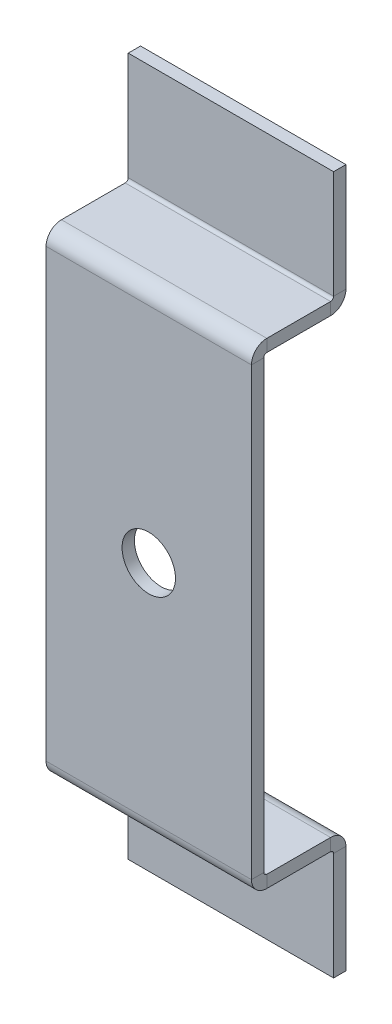
ISO-10303-21;
HEADER;
FILE_DESCRIPTION(('STEP AP214'),'2;1');
FILE_NAME('part.step','',(''),(''),'','','');
FILE_SCHEMA(('AUTOMOTIVE_DESIGN { 1 0 10303 214 1 1 1 1 }'));
ENDSEC;
DATA;
#1=APPLICATION_CONTEXT('core data for automotive mechanical design processes');
#2=APPLICATION_PROTOCOL_DEFINITION('international standard','automotive_design',2000,#1);
#3=PRODUCT_CONTEXT('',#1,'mechanical');
#4=PRODUCT('Part','Part','',(#3));
#5=PRODUCT_RELATED_PRODUCT_CATEGORY('part','',(#4));
#6=PRODUCT_DEFINITION_FORMATION('','',#4);
#7=PRODUCT_DEFINITION_CONTEXT('part definition',#1,'design');
#8=PRODUCT_DEFINITION('design','',#6,#7);
#9=PRODUCT_DEFINITION_SHAPE('','',#8);
#10=(LENGTH_UNIT() NAMED_UNIT(*) SI_UNIT(.MILLI.,.METRE.));
#11=(NAMED_UNIT(*) PLANE_ANGLE_UNIT() SI_UNIT($,.RADIAN.));
#12=(NAMED_UNIT(*) SI_UNIT($,.STERADIAN.) SOLID_ANGLE_UNIT());
#13=UNCERTAINTY_MEASURE_WITH_UNIT(LENGTH_MEASURE(1.E-05),#10,'distance_accuracy_value','');
#14=(GEOMETRIC_REPRESENTATION_CONTEXT(3) GLOBAL_UNCERTAINTY_ASSIGNED_CONTEXT((#13)) GLOBAL_UNIT_ASSIGNED_CONTEXT((#10,
#11,#12)) REPRESENTATION_CONTEXT('',''));
#15=CARTESIAN_POINT('',(0.,0.,0.));
#16=DIRECTION('',(0.,0.,1.));
#17=DIRECTION('',(1.,0.,0.));
#18=AXIS2_PLACEMENT_3D('',#15,#16,#17);
#19=CARTESIAN_POINT('',(0.,113.,-20.));
#20=DIRECTION('',(-1.,0.,0.));
#21=DIRECTION('',(0.,0.,1.));
#22=AXIS2_PLACEMENT_3D('',#19,#20,#21);
#23=PLANE('',#22);
#24=DIRECTION('',(0.,0.,-1.));
#25=VECTOR('',#24,1.);
#26=CARTESIAN_POINT('',(0.,113.,-20.));
#27=LINE('',#26,#25);
#28=CARTESIAN_POINT('',(0.,113.,-3.7366));
#29=VERTEX_POINT('',#28);
#30=CARTESIAN_POINT('',(0.,113.,-19.2634));
#31=VERTEX_POINT('',#30);
#32=EDGE_CURVE('E351',#29,#31,#27,.T.);
#33=ORIENTED_EDGE('',*,*,#32,.T.);
#34=DIRECTION('',(0.,-1.,0.));
#35=VECTOR('',#34,1.);
#36=CARTESIAN_POINT('',(0.,113.,-19.2634));
#37=LINE('',#36,#35);
#38=CARTESIAN_POINT('',(0.,110.,-19.2634));
#39=VERTEX_POINT('',#38);
#40=EDGE_CURVE('E233',#31,#39,#37,.T.);
#41=ORIENTED_EDGE('',*,*,#40,.T.);
#42=DIRECTION('',(0.,0.,-1.));
#43=VECTOR('',#42,1.);
#44=CARTESIAN_POINT('',(0.,110.,-20.));
#45=LINE('',#44,#43);
#46=CARTESIAN_POINT('',(0.,110.,-3.73660000000001));
#47=VERTEX_POINT('',#46);
#48=EDGE_CURVE('E350',#47,#39,#45,.T.);
#49=ORIENTED_EDGE('',*,*,#48,.F.);
#50=DIRECTION('',(0.,1.,0.));
#51=VECTOR('',#50,1.);
#52=CARTESIAN_POINT('',(0.,110.,-3.73660000000001));
#53=LINE('',#52,#51);
#54=EDGE_CURVE('E336',#47,#29,#53,.T.);
#55=ORIENTED_EDGE('',*,*,#54,.T.);
#56=EDGE_LOOP('',(#33,#41,#49,#55));
#57=FACE_BOUND('',#56,.T.);
#58=ADVANCED_FACE('F39',(#57),#23,.T.);
#59=CARTESIAN_POINT('',(0.,113.,3.69664246101139E-13));
#60=DIRECTION('',(0.,1.,0.));
#61=DIRECTION('',(0.,0.,1.));
#62=AXIS2_PLACEMENT_3D('',#59,#60,#61);
#63=PLANE('',#62);
#64=DIRECTION('',(0.,0.,1.));
#65=VECTOR('',#64,1.);
#66=CARTESIAN_POINT('',(50.,113.,-2.99999999999999));
#67=LINE('',#66,#65);
#68=CARTESIAN_POINT('',(50.,113.,-19.2634));
#69=VERTEX_POINT('',#68);
#70=CARTESIAN_POINT('',(50.,113.,-3.7366));
#71=VERTEX_POINT('',#70);
#72=EDGE_CURVE('E353',#69,#71,#67,.T.);
#73=ORIENTED_EDGE('',*,*,#72,.F.);
#74=DIRECTION('',(-1.,0.,0.));
#75=VECTOR('',#74,1.);
#76=CARTESIAN_POINT('',(0.,113.,-19.2634));
#77=LINE('',#76,#75);
#78=EDGE_CURVE('E63',#31,#69,#77,.F.);
#79=ORIENTED_EDGE('',*,*,#78,.F.);
#80=ORIENTED_EDGE('',*,*,#32,.F.);
#81=DIRECTION('',(1.,0.,0.));
#82=VECTOR('',#81,1.);
#83=CARTESIAN_POINT('',(0.,113.,-3.7366));
#84=LINE('',#83,#82);
#85=EDGE_CURVE('E345',#29,#71,#84,.T.);
#86=ORIENTED_EDGE('',*,*,#85,.T.);
#87=EDGE_LOOP('',(#73,#79,#80,#86));
#88=FACE_BOUND('',#87,.T.);
#89=ADVANCED_FACE('F400',(#88),#63,.T.);
#90=CARTESIAN_POINT('',(0.,110.,3.59189802084609E-13));
#91=DIRECTION('',(0.,1.,0.));
#92=DIRECTION('',(0.,0.,1.));
#93=AXIS2_PLACEMENT_3D('',#90,#91,#92);
#94=PLANE('',#93);
#95=DIRECTION('',(-1.,0.,0.));
#96=VECTOR('',#95,1.);
#97=CARTESIAN_POINT('',(0.,110.,-19.2634));
#98=LINE('',#97,#96);
#99=CARTESIAN_POINT('',(50.,110.,-19.2634));
#100=VERTEX_POINT('',#99);
#101=EDGE_CURVE('E186',#39,#100,#98,.F.);
#102=ORIENTED_EDGE('',*,*,#101,.T.);
#103=DIRECTION('',(0.,0.,1.));
#104=VECTOR('',#103,1.);
#105=CARTESIAN_POINT('',(50.,110.,-3.));
#106=LINE('',#105,#104);
#107=CARTESIAN_POINT('',(50.,110.,-3.73660000000001));
#108=VERTEX_POINT('',#107);
#109=EDGE_CURVE('E354',#100,#108,#106,.T.);
#110=ORIENTED_EDGE('',*,*,#109,.T.);
#111=DIRECTION('',(1.,0.,0.));
#112=VECTOR('',#111,1.);
#113=CARTESIAN_POINT('',(0.,110.,-3.73660000000001));
#114=LINE('',#113,#112);
#115=EDGE_CURVE('E339',#47,#108,#114,.T.);
#116=ORIENTED_EDGE('',*,*,#115,.F.);
#117=ORIENTED_EDGE('',*,*,#48,.T.);
#118=EDGE_LOOP('',(#102,#110,#116,#117));
#119=FACE_BOUND('',#118,.T.);
#120=ADVANCED_FACE('F408',(#119),#94,.F.);
#121=CARTESIAN_POINT('',(50.,-3.,-2.99999999999999));
#122=DIRECTION('',(1.,0.,0.));
#123=DIRECTION('',(0.,0.,-1.));
#124=AXIS2_PLACEMENT_3D('',#121,#122,#123);
#125=PLANE('',#124);
#126=DIRECTION('',(0.,0.,-1.));
#127=VECTOR('',#126,1.);
#128=CARTESIAN_POINT('',(50.,-3.,-2.99999999999999));
#129=LINE('',#128,#127);
#130=CARTESIAN_POINT('',(50.,-3.,-3.73659999999999));
#131=VERTEX_POINT('',#130);
#132=CARTESIAN_POINT('',(50.,-3.00000000000006,-19.2634));
#133=VERTEX_POINT('',#132);
#134=EDGE_CURVE('E306',#131,#133,#129,.T.);
#135=ORIENTED_EDGE('',*,*,#134,.T.);
#136=DIRECTION('',(0.,1.,0.));
#137=VECTOR('',#136,1.);
#138=CARTESIAN_POINT('',(50.,-3.00000000000006,-19.2634));
#139=LINE('',#138,#137);
#140=CARTESIAN_POINT('',(50.,0.,-19.2634));
#141=VERTEX_POINT('',#140);
#142=EDGE_CURVE('E279',#133,#141,#139,.T.);
#143=ORIENTED_EDGE('',*,*,#142,.T.);
#144=DIRECTION('',(0.,0.,-1.));
#145=VECTOR('',#144,1.);
#146=CARTESIAN_POINT('',(50.,0.,-3.));
#147=LINE('',#146,#145);
#148=CARTESIAN_POINT('',(50.,0.,-3.7366));
#149=VERTEX_POINT('',#148);
#150=EDGE_CURVE('E305',#149,#141,#147,.T.);
#151=ORIENTED_EDGE('',*,*,#150,.F.);
#152=DIRECTION('',(0.,-1.,0.));
#153=VECTOR('',#152,1.);
#154=CARTESIAN_POINT('',(50.,0.,-3.7366));
#155=LINE('',#154,#153);
#156=EDGE_CURVE('E292',#149,#131,#155,.T.);
#157=ORIENTED_EDGE('',*,*,#156,.T.);
#158=EDGE_LOOP('',(#135,#143,#151,#157));
#159=FACE_BOUND('',#158,.T.);
#160=ADVANCED_FACE('F432',(#159),#125,.T.);
#161=CARTESIAN_POINT('',(0.,-2.99999999999999,0.));
#162=DIRECTION('',(0.,1.,0.));
#163=DIRECTION('',(0.,0.,1.));
#164=AXIS2_PLACEMENT_3D('',#161,#162,#163);
#165=PLANE('',#164);
#166=DIRECTION('',(1.,0.,0.));
#167=VECTOR('',#166,1.);
#168=CARTESIAN_POINT('',(50.,-3.00000000000006,-19.2634));
#169=LINE('',#168,#167);
#170=CARTESIAN_POINT('',(0.,-3.00000000000006,-19.2634));
#171=VERTEX_POINT('',#170);
#172=EDGE_CURVE('E285',#133,#171,#169,.F.);
#173=ORIENTED_EDGE('',*,*,#172,.F.);
#174=ORIENTED_EDGE('',*,*,#134,.F.);
#175=DIRECTION('',(1.,0.,0.));
#176=VECTOR('',#175,1.);
#177=CARTESIAN_POINT('',(0.,-3.,-3.73659999999999));
#178=LINE('',#177,#176);
#179=CARTESIAN_POINT('',(0.,-3.,-3.73659999999999));
#180=VERTEX_POINT('',#179);
#181=EDGE_CURVE('E301',#180,#131,#178,.T.);
#182=ORIENTED_EDGE('',*,*,#181,.F.);
#183=DIRECTION('',(0.,0.,1.));
#184=VECTOR('',#183,1.);
#185=CARTESIAN_POINT('',(0.,-3.00000000000006,-20.));
#186=LINE('',#185,#184);
#187=EDGE_CURVE('E309',#171,#180,#186,.T.);
#188=ORIENTED_EDGE('',*,*,#187,.F.);
#189=EDGE_LOOP('',(#173,#174,#182,#188));
#190=FACE_BOUND('',#189,.T.);
#191=ADVANCED_FACE('F445',(#190),#165,.F.);
#192=CARTESIAN_POINT('',(0.,0.,0.));
#193=DIRECTION('',(0.,1.,0.));
#194=DIRECTION('',(0.,0.,1.));
#195=AXIS2_PLACEMENT_3D('',#192,#193,#194);
#196=PLANE('',#195);
#197=ORIENTED_EDGE('',*,*,#150,.T.);
#198=DIRECTION('',(1.,0.,0.));
#199=VECTOR('',#198,1.);
#200=CARTESIAN_POINT('',(50.,0.,-19.2634));
#201=LINE('',#200,#199);
#202=CARTESIAN_POINT('',(0.,0.,-19.2634));
#203=VERTEX_POINT('',#202);
#204=EDGE_CURVE('E272',#141,#203,#201,.F.);
#205=ORIENTED_EDGE('',*,*,#204,.T.);
#206=DIRECTION('',(0.,0.,1.));
#207=VECTOR('',#206,1.);
#208=CARTESIAN_POINT('',(0.,0.,-20.));
#209=LINE('',#208,#207);
#210=CARTESIAN_POINT('',(0.,0.,-3.7366));
#211=VERTEX_POINT('',#210);
#212=EDGE_CURVE('E310',#203,#211,#209,.T.);
#213=ORIENTED_EDGE('',*,*,#212,.T.);
#214=DIRECTION('',(-1.,0.,0.));
#215=VECTOR('',#214,1.);
#216=CARTESIAN_POINT('',(50.,0.,-3.7366));
#217=LINE('',#216,#215);
#218=EDGE_CURVE('E295',#149,#211,#217,.T.);
#219=ORIENTED_EDGE('',*,*,#218,.F.);
#220=EDGE_LOOP('',(#197,#205,#213,#219));
#221=FACE_BOUND('',#220,.T.);
#222=ADVANCED_FACE('F429',(#221),#196,.T.);
#223=CARTESIAN_POINT('',(0.,0.,-3.));
#224=DIRECTION('',(0.,0.,-1.));
#225=DIRECTION('',(-1.,0.,0.));
#226=AXIS2_PLACEMENT_3D('',#223,#224,#225);
#227=PLANE('',#226);
#228=CARTESIAN_POINT('',(25.,54.9999999999999,-3.));
#229=DIRECTION('',(0.,0.,-1.));
#230=DIRECTION('',(-1.,0.,0.));
#231=AXIS2_PLACEMENT_3D('',#228,#229,#230);
#232=CIRCLE('',#231,6.5);
#233=CARTESIAN_POINT('',(18.5,54.9999999999999,-3.));
#234=VERTEX_POINT('',#233);
#235=EDGE_CURVE('E489',#234,#234,#232,.T.);
#236=ORIENTED_EDGE('',*,*,#235,.F.);
#237=EDGE_LOOP('',(#236));
#238=FACE_BOUND('',#237,.T.);
#239=DIRECTION('',(0.,1.,0.));
#240=VECTOR('',#239,1.);
#241=CARTESIAN_POINT('',(50.,0.,-3.));
#242=LINE('',#241,#240);
#243=CARTESIAN_POINT('',(50.,0.736600000000001,-3.));
#244=VERTEX_POINT('',#243);
#245=CARTESIAN_POINT('',(50.,109.2634,-3.));
#246=VERTEX_POINT('',#245);
#247=EDGE_CURVE('E11',#244,#246,#242,.T.);
#248=ORIENTED_EDGE('',*,*,#247,.F.);
#249=DIRECTION('',(-1.,0.,0.));
#250=VECTOR('',#249,1.);
#251=CARTESIAN_POINT('',(0.,0.736599999999997,-3.));
#252=LINE('',#251,#250);
#253=CARTESIAN_POINT('',(0.,0.736599999999997,-3.));
#254=VERTEX_POINT('',#253);
#255=EDGE_CURVE('E328',#254,#244,#252,.F.);
#256=ORIENTED_EDGE('',*,*,#255,.F.);
#257=DIRECTION('',(0.,-1.,0.));
#258=VECTOR('',#257,1.);
#259=CARTESIAN_POINT('',(0.,0.,-3.));
#260=LINE('',#259,#258);
#261=CARTESIAN_POINT('',(0.,109.2634,-3.));
#262=VERTEX_POINT('',#261);
#263=EDGE_CURVE('E48',#262,#254,#260,.T.);
#264=ORIENTED_EDGE('',*,*,#263,.F.);
#265=DIRECTION('',(1.,0.,0.));
#266=VECTOR('',#265,1.);
#267=CARTESIAN_POINT('',(50.,109.2634,-3.));
#268=LINE('',#267,#266);
#269=EDGE_CURVE('E372',#246,#262,#268,.F.);
#270=ORIENTED_EDGE('',*,*,#269,.F.);
#271=EDGE_LOOP('',(#248,#256,#264,#270));
#272=FACE_BOUND('',#271,.T.);
#273=ADVANCED_FACE('F415',(#238,#272),#227,.T.);
#274=CARTESIAN_POINT('',(0.,0.,0.));
#275=DIRECTION('',(0.,0.,-1.));
#276=DIRECTION('',(-1.,0.,0.));
#277=AXIS2_PLACEMENT_3D('',#274,#275,#276);
#278=PLANE('',#277);
#279=CARTESIAN_POINT('',(25.,54.9999999999999,0.));
#280=DIRECTION('',(0.,0.,1.));
#281=DIRECTION('',(1.,0.,0.));
#282=AXIS2_PLACEMENT_3D('',#279,#280,#281);
#283=CIRCLE('',#282,6.5);
#284=CARTESIAN_POINT('',(31.5,54.9999999999999,0.));
#285=VERTEX_POINT('',#284);
#286=EDGE_CURVE('E487',#285,#285,#283,.T.);
#287=ORIENTED_EDGE('',*,*,#286,.F.);
#288=EDGE_LOOP('',(#287));
#289=FACE_BOUND('',#288,.T.);
#290=DIRECTION('',(-1.,0.,0.));
#291=VECTOR('',#290,1.);
#292=CARTESIAN_POINT('',(0.,0.736600000000005,0.));
#293=LINE('',#292,#291);
#294=CARTESIAN_POINT('',(0.,0.736600000000005,0.));
#295=VERTEX_POINT('',#294);
#296=CARTESIAN_POINT('',(50.,0.736600000000001,0.));
#297=VERTEX_POINT('',#296);
#298=EDGE_CURVE('E316',#295,#297,#293,.F.);
#299=ORIENTED_EDGE('',*,*,#298,.T.);
#300=DIRECTION('',(0.,1.,0.));
#301=VECTOR('',#300,1.);
#302=CARTESIAN_POINT('',(50.,0.,0.));
#303=LINE('',#302,#301);
#304=CARTESIAN_POINT('',(50.,109.2634,0.));
#305=VERTEX_POINT('',#304);
#306=EDGE_CURVE('E43',#297,#305,#303,.T.);
#307=ORIENTED_EDGE('',*,*,#306,.T.);
#308=DIRECTION('',(1.,0.,0.));
#309=VECTOR('',#308,1.);
#310=CARTESIAN_POINT('',(50.,109.2634,0.));
#311=LINE('',#310,#309);
#312=CARTESIAN_POINT('',(0.,109.2634,0.));
#313=VERTEX_POINT('',#312);
#314=EDGE_CURVE('E360',#305,#313,#311,.F.);
#315=ORIENTED_EDGE('',*,*,#314,.T.);
#316=DIRECTION('',(0.,-1.,0.));
#317=VECTOR('',#316,1.);
#318=CARTESIAN_POINT('',(0.,0.,0.));
#319=LINE('',#318,#317);
#320=EDGE_CURVE('E380',#313,#295,#319,.T.);
#321=ORIENTED_EDGE('',*,*,#320,.T.);
#322=EDGE_LOOP('',(#299,#307,#315,#321));
#323=FACE_BOUND('',#322,.T.);
#324=ADVANCED_FACE('F388',(#289,#323),#278,.F.);
#325=CARTESIAN_POINT('',(0.,0.,-3.));
#326=DIRECTION('',(-1.,0.,0.));
#327=DIRECTION('',(0.,-1.,0.));
#328=AXIS2_PLACEMENT_3D('',#325,#326,#327);
#329=PLANE('',#328);
#330=ORIENTED_EDGE('',*,*,#263,.T.);
#331=DIRECTION('',(0.,0.,1.));
#332=VECTOR('',#331,1.);
#333=CARTESIAN_POINT('',(0.,0.736599999999997,-3.));
#334=LINE('',#333,#332);
#335=EDGE_CURVE('E322',#254,#295,#334,.T.);
#336=ORIENTED_EDGE('',*,*,#335,.T.);
#337=ORIENTED_EDGE('',*,*,#320,.F.);
#338=DIRECTION('',(0.,0.,1.));
#339=VECTOR('',#338,1.);
#340=CARTESIAN_POINT('',(0.,109.2634,-3.));
#341=LINE('',#340,#339);
#342=EDGE_CURVE('E377',#262,#313,#341,.T.);
#343=ORIENTED_EDGE('',*,*,#342,.F.);
#344=EDGE_LOOP('',(#330,#336,#337,#343));
#345=FACE_BOUND('',#344,.T.);
#346=ADVANCED_FACE('F41',(#345),#329,.T.);
#347=CARTESIAN_POINT('',(50.,0.,-3.));
#348=DIRECTION('',(1.,0.,0.));
#349=DIRECTION('',(0.,1.,0.));
#350=AXIS2_PLACEMENT_3D('',#347,#348,#349);
#351=PLANE('',#350);
#352=DIRECTION('',(0.,0.,1.));
#353=VECTOR('',#352,1.);
#354=CARTESIAN_POINT('',(50.,0.736600000000001,-3.));
#355=LINE('',#354,#353);
#356=EDGE_CURVE('E333',#244,#297,#355,.T.);
#357=ORIENTED_EDGE('',*,*,#356,.F.);
#358=ORIENTED_EDGE('',*,*,#247,.T.);
#359=DIRECTION('',(0.,0.,1.));
#360=VECTOR('',#359,1.);
#361=CARTESIAN_POINT('',(50.,109.2634,-3.));
#362=LINE('',#361,#360);
#363=EDGE_CURVE('E366',#246,#305,#362,.T.);
#364=ORIENTED_EDGE('',*,*,#363,.T.);
#365=ORIENTED_EDGE('',*,*,#306,.F.);
#366=EDGE_LOOP('',(#357,#358,#364,#365));
#367=FACE_BOUND('',#366,.T.);
#368=ADVANCED_FACE('F455',(#367),#351,.T.);
#369=CARTESIAN_POINT('',(0.,109.2634,-3.73660000000001));
#370=DIRECTION('',(-1.,0.,0.));
#371=DIRECTION('',(0.,0.,1.));
#372=AXIS2_PLACEMENT_3D('',#369,#370,#371);
#373=PLANE('',#372);
#374=ORIENTED_EDGE('',*,*,#54,.F.);
#375=CARTESIAN_POINT('',(0.,109.2634,-3.73660000000001));
#376=DIRECTION('',(1.,0.,0.));
#377=DIRECTION('',(0.,0.,-1.));
#378=AXIS2_PLACEMENT_3D('',#375,#376,#377);
#379=CIRCLE('',#378,0.736600000000004);
#380=EDGE_CURVE('E369',#262,#47,#379,.F.);
#381=ORIENTED_EDGE('',*,*,#380,.F.);
#382=ORIENTED_EDGE('',*,*,#342,.T.);
#383=CARTESIAN_POINT('',(0.,109.2634,-3.73660000000001));
#384=DIRECTION('',(1.,0.,0.));
#385=DIRECTION('',(0.,0.,-1.));
#386=AXIS2_PLACEMENT_3D('',#383,#384,#385);
#387=CIRCLE('',#386,3.7366);
#388=EDGE_CURVE('E362',#313,#29,#387,.F.);
#389=ORIENTED_EDGE('',*,*,#388,.T.);
#390=EDGE_LOOP('',(#374,#381,#382,#389));
#391=FACE_BOUND('',#390,.T.);
#392=ADVANCED_FACE('F402',(#391),#373,.T.);
#393=CARTESIAN_POINT('',(50.,109.2634,-3.73660000000001));
#394=DIRECTION('',(-1.,0.,0.));
#395=DIRECTION('',(0.,0.,1.));
#396=AXIS2_PLACEMENT_3D('',#393,#394,#395);
#397=PLANE('',#396);
#398=CARTESIAN_POINT('',(50.,109.2634,-3.73660000000001));
#399=DIRECTION('',(1.,0.,0.));
#400=DIRECTION('',(0.,0.,-1.));
#401=AXIS2_PLACEMENT_3D('',#398,#399,#400);
#402=CIRCLE('',#401,0.736600000000004);
#403=EDGE_CURVE('E356',#108,#246,#402,.T.);
#404=ORIENTED_EDGE('',*,*,#403,.F.);
#405=DIRECTION('',(0.,1.,0.));
#406=VECTOR('',#405,1.);
#407=CARTESIAN_POINT('',(50.,110.,-3.73660000000001));
#408=LINE('',#407,#406);
#409=EDGE_CURVE('E342',#108,#71,#408,.T.);
#410=ORIENTED_EDGE('',*,*,#409,.T.);
#411=CARTESIAN_POINT('',(50.,109.2634,-3.73660000000001));
#412=DIRECTION('',(1.,0.,0.));
#413=DIRECTION('',(0.,0.,-1.));
#414=AXIS2_PLACEMENT_3D('',#411,#412,#413);
#415=CIRCLE('',#414,3.7366);
#416=EDGE_CURVE('E363',#71,#305,#415,.T.);
#417=ORIENTED_EDGE('',*,*,#416,.T.);
#418=ORIENTED_EDGE('',*,*,#363,.F.);
#419=EDGE_LOOP('',(#404,#410,#417,#418));
#420=FACE_BOUND('',#419,.T.);
#421=ADVANCED_FACE('F398',(#420),#397,.F.);
#422=CARTESIAN_POINT('',(50.,109.2634,-3.73660000000001));
#423=DIRECTION('',(1.,0.,0.));
#424=DIRECTION('',(0.,1.,0.));
#425=AXIS2_PLACEMENT_3D('',#422,#423,#424);
#426=CYLINDRICAL_SURFACE('',#425,3.7366);
#427=ORIENTED_EDGE('',*,*,#314,.F.);
#428=ORIENTED_EDGE('',*,*,#416,.F.);
#429=ORIENTED_EDGE('',*,*,#85,.F.);
#430=ORIENTED_EDGE('',*,*,#388,.F.);
#431=EDGE_LOOP('',(#427,#428,#429,#430));
#432=FACE_BOUND('',#431,.T.);
#433=ADVANCED_FACE('F394',(#432),#426,.T.);
#434=CARTESIAN_POINT('',(50.,109.2634,-3.73660000000001));
#435=DIRECTION('',(1.,0.,0.));
#436=DIRECTION('',(0.,1.,0.));
#437=AXIS2_PLACEMENT_3D('',#434,#435,#436);
#438=CYLINDRICAL_SURFACE('',#437,0.736600000000004);
#439=ORIENTED_EDGE('',*,*,#269,.T.);
#440=ORIENTED_EDGE('',*,*,#380,.T.);
#441=ORIENTED_EDGE('',*,*,#115,.T.);
#442=ORIENTED_EDGE('',*,*,#403,.T.);
#443=EDGE_LOOP('',(#439,#440,#441,#442));
#444=FACE_BOUND('',#443,.T.);
#445=ADVANCED_FACE('F410',(#444),#438,.F.);
#446=CARTESIAN_POINT('',(50.,113.,-2.99999999999999));
#447=DIRECTION('',(1.,0.,0.));
#448=DIRECTION('',(0.,0.,-1.));
#449=AXIS2_PLACEMENT_3D('',#446,#447,#448);
#450=PLANE('',#449);
#451=DIRECTION('',(0.,-1.,0.));
#452=VECTOR('',#451,1.);
#453=CARTESIAN_POINT('',(50.,113.,-19.2634));
#454=LINE('',#453,#452);
#455=EDGE_CURVE('E56',#69,#100,#454,.T.);
#456=ORIENTED_EDGE('',*,*,#455,.F.);
#457=ORIENTED_EDGE('',*,*,#72,.T.);
#458=ORIENTED_EDGE('',*,*,#409,.F.);
#459=ORIENTED_EDGE('',*,*,#109,.F.);
#460=EDGE_LOOP('',(#456,#457,#458,#459));
#461=FACE_BOUND('',#460,.T.);
#462=ADVANCED_FACE('F471',(#461),#450,.T.);
#463=CARTESIAN_POINT('',(50.,0.736599999999999,-3.7366));
#464=DIRECTION('',(1.,0.,0.));
#465=DIRECTION('',(0.,1.,0.));
#466=AXIS2_PLACEMENT_3D('',#463,#464,#465);
#467=PLANE('',#466);
#468=ORIENTED_EDGE('',*,*,#156,.F.);
#469=CARTESIAN_POINT('',(50.,0.736599999999999,-3.7366));
#470=DIRECTION('',(-1.,0.,0.));
#471=DIRECTION('',(0.,-1.,0.));
#472=AXIS2_PLACEMENT_3D('',#469,#470,#471);
#473=CIRCLE('',#472,0.736600000000002);
#474=EDGE_CURVE('E325',#244,#149,#473,.F.);
#475=ORIENTED_EDGE('',*,*,#474,.F.);
#476=ORIENTED_EDGE('',*,*,#356,.T.);
#477=CARTESIAN_POINT('',(50.,0.736599999999999,-3.7366));
#478=DIRECTION('',(-1.,0.,0.));
#479=DIRECTION('',(0.,-1.,0.));
#480=AXIS2_PLACEMENT_3D('',#477,#478,#479);
#481=CIRCLE('',#480,3.7366);
#482=EDGE_CURVE('E318',#297,#131,#481,.F.);
#483=ORIENTED_EDGE('',*,*,#482,.T.);
#484=EDGE_LOOP('',(#468,#475,#476,#483));
#485=FACE_BOUND('',#484,.T.);
#486=ADVANCED_FACE('F454',(#485),#467,.T.);
#487=CARTESIAN_POINT('',(0.,0.736599999999996,-3.7366));
#488=DIRECTION('',(1.,0.,0.));
#489=DIRECTION('',(0.,1.,0.));
#490=AXIS2_PLACEMENT_3D('',#487,#488,#489);
#491=PLANE('',#490);
#492=CARTESIAN_POINT('',(0.,0.736599999999996,-3.7366));
#493=DIRECTION('',(-1.,0.,0.));
#494=DIRECTION('',(0.,-1.,0.));
#495=AXIS2_PLACEMENT_3D('',#492,#493,#494);
#496=CIRCLE('',#495,0.736600000000002);
#497=EDGE_CURVE('E312',#211,#254,#496,.T.);
#498=ORIENTED_EDGE('',*,*,#497,.F.);
#499=DIRECTION('',(0.,-1.,0.));
#500=VECTOR('',#499,1.);
#501=CARTESIAN_POINT('',(0.,0.,-3.7366));
#502=LINE('',#501,#500);
#503=EDGE_CURVE('E298',#211,#180,#502,.T.);
#504=ORIENTED_EDGE('',*,*,#503,.T.);
#505=CARTESIAN_POINT('',(0.,0.736599999999996,-3.7366));
#506=DIRECTION('',(-1.,0.,0.));
#507=DIRECTION('',(0.,-1.,0.));
#508=AXIS2_PLACEMENT_3D('',#505,#506,#507);
#509=CIRCLE('',#508,3.7366);
#510=EDGE_CURVE('E319',#180,#295,#509,.T.);
#511=ORIENTED_EDGE('',*,*,#510,.T.);
#512=ORIENTED_EDGE('',*,*,#335,.F.);
#513=EDGE_LOOP('',(#498,#504,#511,#512));
#514=FACE_BOUND('',#513,.T.);
#515=ADVANCED_FACE('F420',(#514),#491,.F.);
#516=CARTESIAN_POINT('',(0.,0.736599999999996,-3.7366));
#517=DIRECTION('',(-1.,0.,0.));
#518=DIRECTION('',(0.,-1.,0.));
#519=AXIS2_PLACEMENT_3D('',#516,#517,#518);
#520=CYLINDRICAL_SURFACE('',#519,3.7366);
#521=ORIENTED_EDGE('',*,*,#298,.F.);
#522=ORIENTED_EDGE('',*,*,#510,.F.);
#523=ORIENTED_EDGE('',*,*,#181,.T.);
#524=ORIENTED_EDGE('',*,*,#482,.F.);
#525=EDGE_LOOP('',(#521,#522,#523,#524));
#526=FACE_BOUND('',#525,.T.);
#527=ADVANCED_FACE('F451',(#526),#520,.T.);
#528=CARTESIAN_POINT('',(0.,0.736599999999996,-3.7366));
#529=DIRECTION('',(-1.,0.,0.));
#530=DIRECTION('',(0.,-1.,0.));
#531=AXIS2_PLACEMENT_3D('',#528,#529,#530);
#532=CYLINDRICAL_SURFACE('',#531,0.736600000000002);
#533=ORIENTED_EDGE('',*,*,#255,.T.);
#534=ORIENTED_EDGE('',*,*,#474,.T.);
#535=ORIENTED_EDGE('',*,*,#218,.T.);
#536=ORIENTED_EDGE('',*,*,#497,.T.);
#537=EDGE_LOOP('',(#533,#534,#535,#536));
#538=FACE_BOUND('',#537,.T.);
#539=ADVANCED_FACE('F424',(#538),#532,.F.);
#540=CARTESIAN_POINT('',(0.,-3.00000000000006,-20.));
#541=DIRECTION('',(-1.,0.,0.));
#542=DIRECTION('',(0.,0.,1.));
#543=AXIS2_PLACEMENT_3D('',#540,#541,#542);
#544=PLANE('',#543);
#545=DIRECTION('',(0.,1.,0.));
#546=VECTOR('',#545,1.);
#547=CARTESIAN_POINT('',(0.,-3.00000000000006,-19.2634));
#548=LINE('',#547,#546);
#549=EDGE_CURVE('E289',#171,#203,#548,.T.);
#550=ORIENTED_EDGE('',*,*,#549,.F.);
#551=ORIENTED_EDGE('',*,*,#187,.T.);
#552=ORIENTED_EDGE('',*,*,#503,.F.);
#553=ORIENTED_EDGE('',*,*,#212,.F.);
#554=EDGE_LOOP('',(#550,#551,#552,#553));
#555=FACE_BOUND('',#554,.T.);
#556=ADVANCED_FACE('F449',(#555),#544,.T.);
#557=CARTESIAN_POINT('',(0.,-3.73660000000006,-19.2634));
#558=DIRECTION('',(-1.,0.,0.));
#559=DIRECTION('',(0.,0.,1.));
#560=AXIS2_PLACEMENT_3D('',#557,#558,#559);
#561=PLANE('',#560);
#562=DIRECTION('',(0.,0.,-1.));
#563=VECTOR('',#562,1.);
#564=CARTESIAN_POINT('',(0.,-3.73660000000006,-20.));
#565=LINE('',#564,#563);
#566=CARTESIAN_POINT('',(0.,-3.73660000000006,-20.));
#567=VERTEX_POINT('',#566);
#568=CARTESIAN_POINT('',(0.,-3.73660000000006,-23.));
#569=VERTEX_POINT('',#568);
#570=EDGE_CURVE('E240',#567,#569,#565,.T.);
#571=ORIENTED_EDGE('',*,*,#570,.F.);
#572=CARTESIAN_POINT('',(0.,-3.73660000000006,-19.2634));
#573=DIRECTION('',(1.,0.,0.));
#574=DIRECTION('',(0.,0.,-1.));
#575=AXIS2_PLACEMENT_3D('',#572,#573,#574);
#576=CIRCLE('',#575,0.7366);
#577=EDGE_CURVE('E282',#171,#567,#576,.F.);
#578=ORIENTED_EDGE('',*,*,#577,.F.);
#579=ORIENTED_EDGE('',*,*,#549,.T.);
#580=CARTESIAN_POINT('',(0.,-3.73660000000006,-19.2634));
#581=DIRECTION('',(1.,0.,0.));
#582=DIRECTION('',(0.,0.,-1.));
#583=AXIS2_PLACEMENT_3D('',#580,#581,#582);
#584=CIRCLE('',#583,3.7366);
#585=EDGE_CURVE('E275',#203,#569,#584,.F.);
#586=ORIENTED_EDGE('',*,*,#585,.T.);
#587=EDGE_LOOP('',(#571,#578,#579,#586));
#588=FACE_BOUND('',#587,.T.);
#589=ADVANCED_FACE('F559',(#588),#561,.T.);
#590=CARTESIAN_POINT('',(50.,-3.73660000000006,-19.2634));
#591=DIRECTION('',(-1.,0.,0.));
#592=DIRECTION('',(0.,0.,1.));
#593=AXIS2_PLACEMENT_3D('',#590,#591,#592);
#594=PLANE('',#593);
#595=CARTESIAN_POINT('',(50.,-3.73660000000006,-19.2634));
#596=DIRECTION('',(1.,0.,0.));
#597=DIRECTION('',(0.,0.,-1.));
#598=AXIS2_PLACEMENT_3D('',#595,#596,#597);
#599=CIRCLE('',#598,0.7366);
#600=CARTESIAN_POINT('',(50.,-3.73660000000006,-20.));
#601=VERTEX_POINT('',#600);
#602=EDGE_CURVE('E271',#601,#133,#599,.T.);
#603=ORIENTED_EDGE('',*,*,#602,.F.);
#604=DIRECTION('',(0.,0.,-1.));
#605=VECTOR('',#604,1.);
#606=CARTESIAN_POINT('',(50.,-3.73660000000006,-20.));
#607=LINE('',#606,#605);
#608=CARTESIAN_POINT('',(50.,-3.73660000000003,-23.));
#609=VERTEX_POINT('',#608);
#610=EDGE_CURVE('E244',#601,#609,#607,.T.);
#611=ORIENTED_EDGE('',*,*,#610,.T.);
#612=CARTESIAN_POINT('',(50.,-3.73660000000006,-19.2634));
#613=DIRECTION('',(1.,0.,0.));
#614=DIRECTION('',(0.,0.,-1.));
#615=AXIS2_PLACEMENT_3D('',#612,#613,#614);
#616=CIRCLE('',#615,3.7366);
#617=EDGE_CURVE('E276',#609,#141,#616,.T.);
#618=ORIENTED_EDGE('',*,*,#617,.T.);
#619=ORIENTED_EDGE('',*,*,#142,.F.);
#620=EDGE_LOOP('',(#603,#611,#618,#619));
#621=FACE_BOUND('',#620,.T.);
#622=ADVANCED_FACE('F436',(#621),#594,.F.);
#623=CARTESIAN_POINT('',(50.,-3.73660000000006,-19.2634));
#624=DIRECTION('',(1.,0.,0.));
#625=DIRECTION('',(0.,0.,-1.));
#626=AXIS2_PLACEMENT_3D('',#623,#624,#625);
#627=CYLINDRICAL_SURFACE('',#626,3.7366);
#628=ORIENTED_EDGE('',*,*,#204,.F.);
#629=ORIENTED_EDGE('',*,*,#617,.F.);
#630=DIRECTION('',(-1.,0.,0.));
#631=VECTOR('',#630,1.);
#632=CARTESIAN_POINT('',(0.,-3.73660000000003,-23.));
#633=LINE('',#632,#631);
#634=EDGE_CURVE('E247',#609,#569,#633,.T.);
#635=ORIENTED_EDGE('',*,*,#634,.T.);
#636=ORIENTED_EDGE('',*,*,#585,.F.);
#637=EDGE_LOOP('',(#628,#629,#635,#636));
#638=FACE_BOUND('',#637,.T.);
#639=ADVANCED_FACE('F553',(#638),#627,.T.);
#640=CARTESIAN_POINT('',(50.,-3.73660000000006,-19.2634));
#641=DIRECTION('',(1.,0.,0.));
#642=DIRECTION('',(0.,0.,-1.));
#643=AXIS2_PLACEMENT_3D('',#640,#641,#642);
#644=CYLINDRICAL_SURFACE('',#643,0.7366);
#645=ORIENTED_EDGE('',*,*,#172,.T.);
#646=ORIENTED_EDGE('',*,*,#577,.T.);
#647=DIRECTION('',(1.,0.,0.));
#648=VECTOR('',#647,1.);
#649=CARTESIAN_POINT('',(0.,-3.73660000000006,-20.));
#650=LINE('',#649,#648);
#651=EDGE_CURVE('E242',#567,#601,#650,.T.);
#652=ORIENTED_EDGE('',*,*,#651,.T.);
#653=ORIENTED_EDGE('',*,*,#602,.T.);
#654=EDGE_LOOP('',(#645,#646,#652,#653));
#655=FACE_BOUND('',#654,.T.);
#656=ADVANCED_FACE('F440',(#655),#644,.F.);
#657=CARTESIAN_POINT('',(50.,-30.0000000000001,-23.));
#658=DIRECTION('',(-1.,0.,0.));
#659=DIRECTION('',(0.,0.,1.));
#660=AXIS2_PLACEMENT_3D('',#657,#658,#659);
#661=PLANE('',#660);
#662=ORIENTED_EDGE('',*,*,#610,.F.);
#663=DIRECTION('',(0.,-1.,0.));
#664=VECTOR('',#663,1.);
#665=CARTESIAN_POINT('',(50.,-30.0000000000001,-20.));
#666=LINE('',#665,#664);
#667=CARTESIAN_POINT('',(50.,-30.0000000000001,-20.));
#668=VERTEX_POINT('',#667);
#669=EDGE_CURVE('E251',#601,#668,#666,.T.);
#670=ORIENTED_EDGE('',*,*,#669,.T.);
#671=DIRECTION('',(0.,0.,1.));
#672=VECTOR('',#671,1.);
#673=CARTESIAN_POINT('',(50.,-30.0000000000001,-23.));
#674=LINE('',#673,#672);
#675=CARTESIAN_POINT('',(50.,-30.0000000000001,-23.));
#676=VERTEX_POINT('',#675);
#677=EDGE_CURVE('E268',#676,#668,#674,.T.);
#678=ORIENTED_EDGE('',*,*,#677,.F.);
#679=DIRECTION('',(0.,-1.,0.));
#680=VECTOR('',#679,1.);
#681=CARTESIAN_POINT('',(50.,-30.0000000000001,-23.));
#682=LINE('',#681,#680);
#683=EDGE_CURVE('E252',#609,#676,#682,.T.);
#684=ORIENTED_EDGE('',*,*,#683,.F.);
#685=EDGE_LOOP('',(#662,#670,#678,#684));
#686=FACE_BOUND('',#685,.T.);
#687=ADVANCED_FACE('F545',(#686),#661,.F.);
#688=CARTESIAN_POINT('',(0.,-3.00000000000006,-23.));
#689=DIRECTION('',(1.,0.,0.));
#690=DIRECTION('',(0.,0.,-1.));
#691=AXIS2_PLACEMENT_3D('',#688,#689,#690);
#692=PLANE('',#691);
#693=ORIENTED_EDGE('',*,*,#570,.T.);
#694=DIRECTION('',(0.,1.,0.));
#695=VECTOR('',#694,1.);
#696=CARTESIAN_POINT('',(0.,-3.00000000000006,-23.));
#697=LINE('',#696,#695);
#698=CARTESIAN_POINT('',(0.,-30.0000000000001,-23.));
#699=VERTEX_POINT('',#698);
#700=EDGE_CURVE('E257',#699,#569,#697,.T.);
#701=ORIENTED_EDGE('',*,*,#700,.F.);
#702=DIRECTION('',(0.,0.,1.));
#703=VECTOR('',#702,1.);
#704=CARTESIAN_POINT('',(0.,-30.0000000000001,-23.));
#705=LINE('',#704,#703);
#706=CARTESIAN_POINT('',(0.,-30.0000000000001,-20.));
#707=VERTEX_POINT('',#706);
#708=EDGE_CURVE('E260',#699,#707,#705,.T.);
#709=ORIENTED_EDGE('',*,*,#708,.T.);
#710=DIRECTION('',(0.,1.,0.));
#711=VECTOR('',#710,1.);
#712=CARTESIAN_POINT('',(0.,-3.00000000000006,-20.));
#713=LINE('',#712,#711);
#714=EDGE_CURVE('E255',#707,#567,#713,.T.);
#715=ORIENTED_EDGE('',*,*,#714,.T.);
#716=EDGE_LOOP('',(#693,#701,#709,#715));
#717=FACE_BOUND('',#716,.T.);
#718=ADVANCED_FACE('F538',(#717),#692,.F.);
#719=CARTESIAN_POINT('',(0.,0.,-23.));
#720=DIRECTION('',(0.,0.,1.));
#721=DIRECTION('',(1.,0.,0.));
#722=AXIS2_PLACEMENT_3D('',#719,#720,#721);
#723=PLANE('',#722);
#724=ORIENTED_EDGE('',*,*,#634,.F.);
#725=ORIENTED_EDGE('',*,*,#683,.T.);
#726=DIRECTION('',(-1.,0.,0.));
#727=VECTOR('',#726,1.);
#728=CARTESIAN_POINT('',(0.,-30.0000000000001,-23.));
#729=LINE('',#728,#727);
#730=EDGE_CURVE('E254',#676,#699,#729,.T.);
#731=ORIENTED_EDGE('',*,*,#730,.T.);
#732=ORIENTED_EDGE('',*,*,#700,.T.);
#733=EDGE_LOOP('',(#724,#725,#731,#732));
#734=FACE_BOUND('',#733,.T.);
#735=ADVANCED_FACE('F534',(#734),#723,.F.);
#736=CARTESIAN_POINT('',(0.,0.,-20.));
#737=DIRECTION('',(0.,0.,1.));
#738=DIRECTION('',(1.,0.,0.));
#739=AXIS2_PLACEMENT_3D('',#736,#737,#738);
#740=PLANE('',#739);
#741=ORIENTED_EDGE('',*,*,#669,.F.);
#742=ORIENTED_EDGE('',*,*,#651,.F.);
#743=ORIENTED_EDGE('',*,*,#714,.F.);
#744=DIRECTION('',(-1.,0.,0.));
#745=VECTOR('',#744,1.);
#746=CARTESIAN_POINT('',(0.,-30.0000000000001,-20.));
#747=LINE('',#746,#745);
#748=EDGE_CURVE('E262',#668,#707,#747,.T.);
#749=ORIENTED_EDGE('',*,*,#748,.F.);
#750=EDGE_LOOP('',(#741,#742,#743,#749));
#751=FACE_BOUND('',#750,.T.);
#752=ADVANCED_FACE('F537',(#751),#740,.T.);
#753=CARTESIAN_POINT('',(0.,-30.0000000000001,-23.));
#754=DIRECTION('',(0.,1.,0.));
#755=DIRECTION('',(0.,0.,1.));
#756=AXIS2_PLACEMENT_3D('',#753,#754,#755);
#757=PLANE('',#756);
#758=ORIENTED_EDGE('',*,*,#748,.T.);
#759=ORIENTED_EDGE('',*,*,#708,.F.);
#760=ORIENTED_EDGE('',*,*,#730,.F.);
#761=ORIENTED_EDGE('',*,*,#677,.T.);
#762=EDGE_LOOP('',(#758,#759,#760,#761));
#763=FACE_BOUND('',#762,.T.);
#764=ADVANCED_FACE('F531',(#763),#757,.F.);
#765=CARTESIAN_POINT('',(50.,113.7366,-19.2634));
#766=DIRECTION('',(1.,0.,0.));
#767=DIRECTION('',(0.,0.,-1.));
#768=AXIS2_PLACEMENT_3D('',#765,#766,#767);
#769=PLANE('',#768);
#770=DIRECTION('',(0.,0.,-1.));
#771=VECTOR('',#770,1.);
#772=CARTESIAN_POINT('',(50.,113.7366,-20.));
#773=LINE('',#772,#771);
#774=CARTESIAN_POINT('',(50.,113.7366,-20.));
#775=VERTEX_POINT('',#774);
#776=CARTESIAN_POINT('',(50.,113.7366,-23.));
#777=VERTEX_POINT('',#776);
#778=EDGE_CURVE('E492',#775,#777,#773,.T.);
#779=ORIENTED_EDGE('',*,*,#778,.F.);
#780=CARTESIAN_POINT('',(50.,113.7366,-19.2634));
#781=DIRECTION('',(-1.,0.,0.));
#782=DIRECTION('',(0.,0.,1.));
#783=AXIS2_PLACEMENT_3D('',#780,#781,#782);
#784=CIRCLE('',#783,0.7366);
#785=EDGE_CURVE('E189',#69,#775,#784,.F.);
#786=ORIENTED_EDGE('',*,*,#785,.F.);
#787=ORIENTED_EDGE('',*,*,#455,.T.);
#788=CARTESIAN_POINT('',(50.,113.7366,-19.2634));
#789=DIRECTION('',(-1.,0.,0.));
#790=DIRECTION('',(0.,0.,1.));
#791=AXIS2_PLACEMENT_3D('',#788,#789,#790);
#792=CIRCLE('',#791,3.7366);
#793=EDGE_CURVE('E232',#100,#777,#792,.F.);
#794=ORIENTED_EDGE('',*,*,#793,.T.);
#795=EDGE_LOOP('',(#779,#786,#787,#794));
#796=FACE_BOUND('',#795,.T.);
#797=ADVANCED_FACE('F501',(#796),#769,.T.);
#798=CARTESIAN_POINT('',(0.,113.7366,-19.2634));
#799=DIRECTION('',(1.,0.,0.));
#800=DIRECTION('',(0.,0.,-1.));
#801=AXIS2_PLACEMENT_3D('',#798,#799,#800);
#802=PLANE('',#801);
#803=CARTESIAN_POINT('',(0.,113.7366,-19.2634));
#804=DIRECTION('',(-1.,0.,0.));
#805=DIRECTION('',(0.,0.,1.));
#806=AXIS2_PLACEMENT_3D('',#803,#804,#805);
#807=CIRCLE('',#806,0.7366);
#808=CARTESIAN_POINT('',(0.,113.7366,-20.));
#809=VERTEX_POINT('',#808);
#810=EDGE_CURVE('E196',#809,#31,#807,.T.);
#811=ORIENTED_EDGE('',*,*,#810,.F.);
#812=DIRECTION('',(0.,0.,-1.));
#813=VECTOR('',#812,1.);
#814=CARTESIAN_POINT('',(0.,113.7366,-20.));
#815=LINE('',#814,#813);
#816=CARTESIAN_POINT('',(0.,113.7366,-23.));
#817=VERTEX_POINT('',#816);
#818=EDGE_CURVE('E193',#809,#817,#815,.T.);
#819=ORIENTED_EDGE('',*,*,#818,.T.);
#820=CARTESIAN_POINT('',(0.,113.7366,-19.2634));
#821=DIRECTION('',(-1.,0.,0.));
#822=DIRECTION('',(0.,0.,1.));
#823=AXIS2_PLACEMENT_3D('',#820,#821,#822);
#824=CIRCLE('',#823,3.7366);
#825=EDGE_CURVE('E179',#817,#39,#824,.T.);
#826=ORIENTED_EDGE('',*,*,#825,.T.);
#827=ORIENTED_EDGE('',*,*,#40,.F.);
#828=EDGE_LOOP('',(#811,#819,#826,#827));
#829=FACE_BOUND('',#828,.T.);
#830=ADVANCED_FACE('F194',(#829),#802,.F.);
#831=CARTESIAN_POINT('',(0.,113.7366,-19.2634));
#832=DIRECTION('',(-1.,0.,0.));
#833=DIRECTION('',(0.,0.,-1.));
#834=AXIS2_PLACEMENT_3D('',#831,#832,#833);
#835=CYLINDRICAL_SURFACE('',#834,3.7366);
#836=ORIENTED_EDGE('',*,*,#101,.F.);
#837=ORIENTED_EDGE('',*,*,#825,.F.);
#838=DIRECTION('',(1.,0.,0.));
#839=VECTOR('',#838,1.);
#840=CARTESIAN_POINT('',(0.,113.7366,-23.));
#841=LINE('',#840,#839);
#842=EDGE_CURVE('E184',#817,#777,#841,.T.);
#843=ORIENTED_EDGE('',*,*,#842,.T.);
#844=ORIENTED_EDGE('',*,*,#793,.F.);
#845=EDGE_LOOP('',(#836,#837,#843,#844));
#846=FACE_BOUND('',#845,.T.);
#847=ADVANCED_FACE('F181',(#846),#835,.T.);
#848=CARTESIAN_POINT('',(0.,113.7366,-19.2634));
#849=DIRECTION('',(-1.,0.,0.));
#850=DIRECTION('',(0.,0.,-1.));
#851=AXIS2_PLACEMENT_3D('',#848,#849,#850);
#852=CYLINDRICAL_SURFACE('',#851,0.7366);
#853=ORIENTED_EDGE('',*,*,#78,.T.);
#854=ORIENTED_EDGE('',*,*,#785,.T.);
#855=DIRECTION('',(-1.,0.,0.));
#856=VECTOR('',#855,1.);
#857=CARTESIAN_POINT('',(50.,113.7366,-20.));
#858=LINE('',#857,#856);
#859=EDGE_CURVE('E200',#775,#809,#858,.T.);
#860=ORIENTED_EDGE('',*,*,#859,.T.);
#861=ORIENTED_EDGE('',*,*,#810,.T.);
#862=EDGE_LOOP('',(#853,#854,#860,#861));
#863=FACE_BOUND('',#862,.T.);
#864=ADVANCED_FACE('F504',(#863),#852,.F.);
#865=CARTESIAN_POINT('',(0.,140.,-23.));
#866=DIRECTION('',(1.,0.,0.));
#867=DIRECTION('',(0.,0.,-1.));
#868=AXIS2_PLACEMENT_3D('',#865,#866,#867);
#869=PLANE('',#868);
#870=ORIENTED_EDGE('',*,*,#818,.F.);
#871=DIRECTION('',(0.,1.,0.));
#872=VECTOR('',#871,1.);
#873=CARTESIAN_POINT('',(0.,140.,-20.));
#874=LINE('',#873,#872);
#875=CARTESIAN_POINT('',(0.,140.,-20.));
#876=VERTEX_POINT('',#875);
#877=EDGE_CURVE('E209',#809,#876,#874,.T.);
#878=ORIENTED_EDGE('',*,*,#877,.T.);
#879=DIRECTION('',(0.,0.,1.));
#880=VECTOR('',#879,1.);
#881=CARTESIAN_POINT('',(0.,140.,-23.));
#882=LINE('',#881,#880);
#883=CARTESIAN_POINT('',(0.,140.,-23.));
#884=VERTEX_POINT('',#883);
#885=EDGE_CURVE('E214',#884,#876,#882,.T.);
#886=ORIENTED_EDGE('',*,*,#885,.F.);
#887=DIRECTION('',(0.,1.,0.));
#888=VECTOR('',#887,1.);
#889=CARTESIAN_POINT('',(0.,140.,-23.));
#890=LINE('',#889,#888);
#891=EDGE_CURVE('E205',#817,#884,#890,.T.);
#892=ORIENTED_EDGE('',*,*,#891,.F.);
#893=EDGE_LOOP('',(#870,#878,#886,#892));
#894=FACE_BOUND('',#893,.T.);
#895=ADVANCED_FACE('F212',(#894),#869,.F.);
#896=CARTESIAN_POINT('',(50.,113.,-23.));
#897=DIRECTION('',(-1.,0.,0.));
#898=DIRECTION('',(0.,0.,1.));
#899=AXIS2_PLACEMENT_3D('',#896,#897,#898);
#900=PLANE('',#899);
#901=ORIENTED_EDGE('',*,*,#778,.T.);
#902=DIRECTION('',(0.,-1.,0.));
#903=VECTOR('',#902,1.);
#904=CARTESIAN_POINT('',(50.,113.,-23.));
#905=LINE('',#904,#903);
#906=CARTESIAN_POINT('',(50.,140.,-23.));
#907=VERTEX_POINT('',#906);
#908=EDGE_CURVE('E208',#907,#777,#905,.T.);
#909=ORIENTED_EDGE('',*,*,#908,.F.);
#910=DIRECTION('',(0.,0.,1.));
#911=VECTOR('',#910,1.);
#912=CARTESIAN_POINT('',(50.,140.,-23.));
#913=LINE('',#912,#911);
#914=CARTESIAN_POINT('',(50.,140.,-20.));
#915=VERTEX_POINT('',#914);
#916=EDGE_CURVE('E225',#907,#915,#913,.T.);
#917=ORIENTED_EDGE('',*,*,#916,.T.);
#918=DIRECTION('',(0.,-1.,0.));
#919=VECTOR('',#918,1.);
#920=CARTESIAN_POINT('',(50.,113.,-20.));
#921=LINE('',#920,#919);
#922=EDGE_CURVE('E216',#915,#775,#921,.T.);
#923=ORIENTED_EDGE('',*,*,#922,.T.);
#924=EDGE_LOOP('',(#901,#909,#917,#923));
#925=FACE_BOUND('',#924,.T.);
#926=ADVANCED_FACE('F497',(#925),#900,.F.);
#927=CARTESIAN_POINT('',(0.,0.,-23.));
#928=DIRECTION('',(0.,0.,1.));
#929=DIRECTION('',(0.,-1.,0.));
#930=AXIS2_PLACEMENT_3D('',#927,#928,#929);
#931=PLANE('',#930);
#932=ORIENTED_EDGE('',*,*,#842,.F.);
#933=ORIENTED_EDGE('',*,*,#891,.T.);
#934=DIRECTION('',(1.,0.,0.));
#935=VECTOR('',#934,1.);
#936=CARTESIAN_POINT('',(50.,140.,-23.));
#937=LINE('',#936,#935);
#938=EDGE_CURVE('E215',#884,#907,#937,.T.);
#939=ORIENTED_EDGE('',*,*,#938,.T.);
#940=ORIENTED_EDGE('',*,*,#908,.T.);
#941=EDGE_LOOP('',(#932,#933,#939,#940));
#942=FACE_BOUND('',#941,.T.);
#943=ADVANCED_FACE('F204',(#942),#931,.F.);
#944=CARTESIAN_POINT('',(0.,0.,-20.));
#945=DIRECTION('',(0.,0.,1.));
#946=DIRECTION('',(0.,-1.,0.));
#947=AXIS2_PLACEMENT_3D('',#944,#945,#946);
#948=PLANE('',#947);
#949=ORIENTED_EDGE('',*,*,#877,.F.);
#950=ORIENTED_EDGE('',*,*,#859,.F.);
#951=ORIENTED_EDGE('',*,*,#922,.F.);
#952=DIRECTION('',(1.,0.,0.));
#953=VECTOR('',#952,1.);
#954=CARTESIAN_POINT('',(50.,140.,-20.));
#955=LINE('',#954,#953);
#956=EDGE_CURVE('E220',#876,#915,#955,.T.);
#957=ORIENTED_EDGE('',*,*,#956,.F.);
#958=EDGE_LOOP('',(#949,#950,#951,#957));
#959=FACE_BOUND('',#958,.T.);
#960=ADVANCED_FACE('F506',(#959),#948,.T.);
#961=CARTESIAN_POINT('',(50.,140.,-23.));
#962=DIRECTION('',(0.,-1.,0.));
#963=DIRECTION('',(0.,0.,-1.));
#964=AXIS2_PLACEMENT_3D('',#961,#962,#963);
#965=PLANE('',#964);
#966=ORIENTED_EDGE('',*,*,#956,.T.);
#967=ORIENTED_EDGE('',*,*,#916,.F.);
#968=ORIENTED_EDGE('',*,*,#938,.F.);
#969=ORIENTED_EDGE('',*,*,#885,.T.);
#970=EDGE_LOOP('',(#966,#967,#968,#969));
#971=FACE_BOUND('',#970,.T.);
#972=ADVANCED_FACE('F510',(#971),#965,.F.);
#973=CARTESIAN_POINT('',(25.,54.9999999999999,-23.));
#974=DIRECTION('',(0.,0.,1.));
#975=DIRECTION('',(1.,0.,0.));
#976=AXIS2_PLACEMENT_3D('',#973,#974,#975);
#977=CYLINDRICAL_SURFACE('',#976,6.5);
#978=ORIENTED_EDGE('',*,*,#235,.T.);
#979=EDGE_LOOP('',(#978));
#980=FACE_BOUND('',#979,.T.);
#981=ORIENTED_EDGE('',*,*,#286,.T.);
#982=EDGE_LOOP('',(#981));
#983=FACE_BOUND('',#982,.T.);
#984=ADVANCED_FACE('F512',(#980,#983),#977,.F.);
#985=CLOSED_SHELL('',(#58,#89,#120,#160,#191,#222,#273,#324,#346,#368,#392,#421,#433,#445,#462,
#486,#515,#527,#539,#556,#589,#622,#639,#656,#687,#718,#735,#752,#764,#797,#830,#847,#864,#895,
#926,#943,#960,#972,#984));
#986=MANIFOLD_SOLID_BREP('B2',#985);
#987=ADVANCED_BREP_SHAPE_REPRESENTATION('',(#18,#986),#14);
#988=SHAPE_DEFINITION_REPRESENTATION(#9,#987);
ENDSEC;
END-ISO-10303-21;
